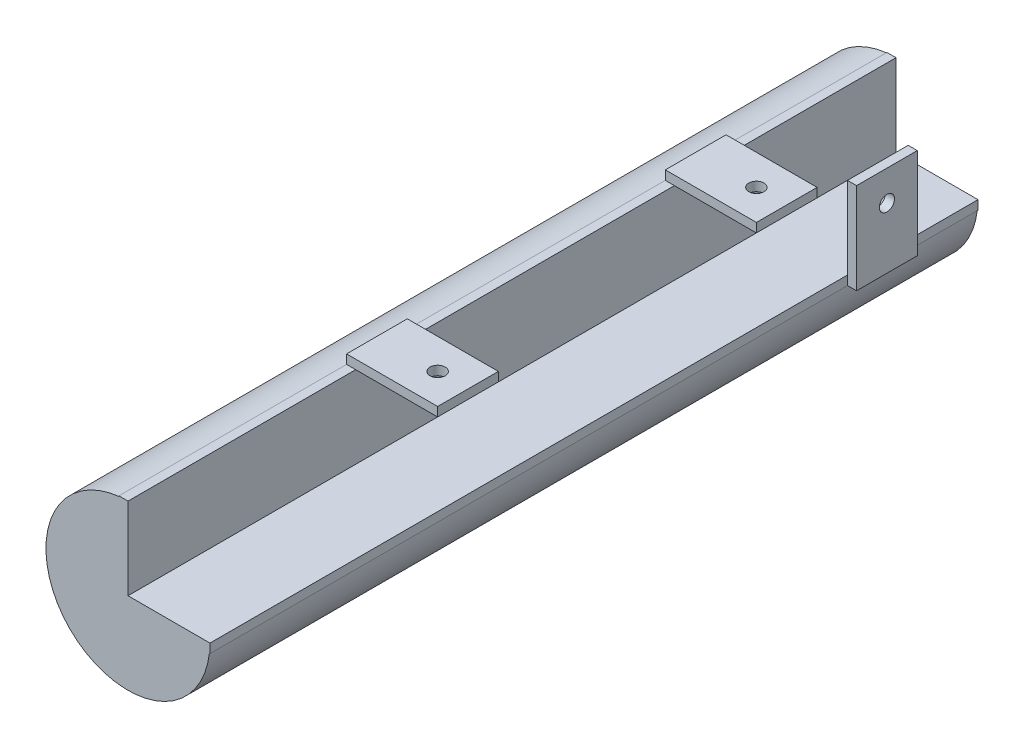
ISO-10303-21;
HEADER;
FILE_DESCRIPTION(('STEP AP214'),'2;1');
FILE_NAME('part.step','',(''),(''),'','','');
FILE_SCHEMA(('AUTOMOTIVE_DESIGN { 1 0 10303 214 1 1 1 1 }'));
ENDSEC;
DATA;
#1=APPLICATION_CONTEXT('core data for automotive mechanical design processes');
#2=APPLICATION_PROTOCOL_DEFINITION('international standard','automotive_design',2000,#1);
#3=PRODUCT_CONTEXT('',#1,'mechanical');
#4=PRODUCT('Part','Part','',(#3));
#5=PRODUCT_RELATED_PRODUCT_CATEGORY('part','',(#4));
#6=PRODUCT_DEFINITION_FORMATION('','',#4);
#7=PRODUCT_DEFINITION_CONTEXT('part definition',#1,'design');
#8=PRODUCT_DEFINITION('design','',#6,#7);
#9=PRODUCT_DEFINITION_SHAPE('','',#8);
#10=(LENGTH_UNIT() NAMED_UNIT(*) SI_UNIT(.MILLI.,.METRE.));
#11=(NAMED_UNIT(*) PLANE_ANGLE_UNIT() SI_UNIT($,.RADIAN.));
#12=(NAMED_UNIT(*) SI_UNIT($,.STERADIAN.) SOLID_ANGLE_UNIT());
#13=UNCERTAINTY_MEASURE_WITH_UNIT(LENGTH_MEASURE(1.E-05),#10,'distance_accuracy_value','');
#14=(GEOMETRIC_REPRESENTATION_CONTEXT(3) GLOBAL_UNCERTAINTY_ASSIGNED_CONTEXT((#13)) GLOBAL_UNIT_ASSIGNED_CONTEXT((#10,
#11,#12)) REPRESENTATION_CONTEXT('',''));
#15=CARTESIAN_POINT('',(0.,0.,0.));
#16=DIRECTION('',(0.,0.,1.));
#17=DIRECTION('',(1.,0.,0.));
#18=AXIS2_PLACEMENT_3D('',#15,#16,#17);
#19=CARTESIAN_POINT('',(0.,27.,126.5));
#20=DIRECTION('',(0.,-1.,0.));
#21=DIRECTION('',(0.,0.,-1.));
#22=AXIS2_PLACEMENT_3D('',#19,#20,#21);
#23=PLANE('',#22);
#24=DIRECTION('',(1.,0.,0.));
#25=VECTOR('',#24,1.);
#26=CARTESIAN_POINT('',(-3.,27.,51.5));
#27=LINE('',#26,#25);
#28=CARTESIAN_POINT('',(-3.,27.,51.5));
#29=VERTEX_POINT('',#28);
#30=CARTESIAN_POINT('',(0.,27.,51.5));
#31=VERTEX_POINT('',#30);
#32=EDGE_CURVE('E229',#29,#31,#27,.T.);
#33=ORIENTED_EDGE('',*,*,#32,.F.);
#34=DIRECTION('',(0.,0.,-1.));
#35=VECTOR('',#34,1.);
#36=CARTESIAN_POINT('',(-3.,27.,126.5));
#37=LINE('',#36,#35);
#38=CARTESIAN_POINT('',(-3.,27.,126.5));
#39=VERTEX_POINT('',#38);
#40=EDGE_CURVE('E403',#39,#29,#37,.T.);
#41=ORIENTED_EDGE('',*,*,#40,.F.);
#42=DIRECTION('',(-1.,0.,0.));
#43=VECTOR('',#42,1.);
#44=CARTESIAN_POINT('',(0.,27.,126.5));
#45=LINE('',#44,#43);
#46=CARTESIAN_POINT('',(0.,27.,126.5));
#47=VERTEX_POINT('',#46);
#48=EDGE_CURVE('E339',#47,#39,#45,.T.);
#49=ORIENTED_EDGE('',*,*,#48,.F.);
#50=DIRECTION('',(0.,0.,-1.));
#51=VECTOR('',#50,1.);
#52=CARTESIAN_POINT('',(0.,27.,126.5));
#53=LINE('',#52,#51);
#54=EDGE_CURVE('E49',#47,#31,#53,.T.);
#55=ORIENTED_EDGE('',*,*,#54,.T.);
#56=EDGE_LOOP('',(#33,#41,#49,#55));
#57=FACE_BOUND('',#56,.T.);
#58=ADVANCED_FACE('F45',(#57),#23,.F.);
#59=DIRECTION('',(-1.,0.,0.));
#60=VECTOR('',#59,1.);
#61=CARTESIAN_POINT('',(-3.,27.,31.5));
#62=LINE('',#61,#60);
#63=CARTESIAN_POINT('',(0.,27.,31.5));
#64=VERTEX_POINT('',#63);
#65=CARTESIAN_POINT('',(-3.,27.,31.5));
#66=VERTEX_POINT('',#65);
#67=EDGE_CURVE('E223',#64,#66,#62,.T.);
#68=ORIENTED_EDGE('',*,*,#67,.F.);
#69=CARTESIAN_POINT('',(0.,27.,-53.5));
#70=VERTEX_POINT('',#69);
#71=EDGE_CURVE('E414',#64,#70,#53,.T.);
#72=ORIENTED_EDGE('',*,*,#71,.T.);
#73=DIRECTION('',(1.,0.,0.));
#74=VECTOR('',#73,1.);
#75=CARTESIAN_POINT('',(-3.,27.,-53.5));
#76=LINE('',#75,#74);
#77=CARTESIAN_POINT('',(-3.,27.,-53.5));
#78=VERTEX_POINT('',#77);
#79=EDGE_CURVE('E261',#78,#70,#76,.T.);
#80=ORIENTED_EDGE('',*,*,#79,.F.);
#81=EDGE_CURVE('E407',#66,#78,#37,.T.);
#82=ORIENTED_EDGE('',*,*,#81,.F.);
#83=EDGE_LOOP('',(#68,#72,#80,#82));
#84=FACE_BOUND('',#83,.T.);
#85=ADVANCED_FACE('F525',(#84),#23,.F.);
#86=DIRECTION('',(-1.,0.,0.));
#87=VECTOR('',#86,1.);
#88=CARTESIAN_POINT('',(-3.,27.,-73.5));
#89=LINE('',#88,#87);
#90=CARTESIAN_POINT('',(0.,27.,-73.5));
#91=VERTEX_POINT('',#90);
#92=CARTESIAN_POINT('',(-3.,27.,-73.5));
#93=VERTEX_POINT('',#92);
#94=EDGE_CURVE('E11',#91,#93,#89,.T.);
#95=ORIENTED_EDGE('',*,*,#94,.F.);
#96=CARTESIAN_POINT('',(0.,27.,-126.5));
#97=VERTEX_POINT('',#96);
#98=EDGE_CURVE('E406',#91,#97,#53,.T.);
#99=ORIENTED_EDGE('',*,*,#98,.T.);
#100=DIRECTION('',(-1.,0.,0.));
#101=VECTOR('',#100,1.);
#102=CARTESIAN_POINT('',(0.,27.,-126.5));
#103=LINE('',#102,#101);
#104=CARTESIAN_POINT('',(-3.,27.,-126.5));
#105=VERTEX_POINT('',#104);
#106=EDGE_CURVE('E362',#97,#105,#103,.T.);
#107=ORIENTED_EDGE('',*,*,#106,.T.);
#108=EDGE_CURVE('E402',#93,#105,#37,.T.);
#109=ORIENTED_EDGE('',*,*,#108,.F.);
#110=EDGE_LOOP('',(#95,#99,#107,#109));
#111=FACE_BOUND('',#110,.T.);
#112=ADVANCED_FACE('F422',(#111),#23,.F.);
#113=CARTESIAN_POINT('',(27.,0.,126.5));
#114=DIRECTION('',(-1.,0.,0.));
#115=DIRECTION('',(0.,0.,1.));
#116=AXIS2_PLACEMENT_3D('',#113,#114,#115);
#117=PLANE('',#116);
#118=DIRECTION('',(0.,-1.,0.));
#119=VECTOR('',#118,1.);
#120=CARTESIAN_POINT('',(27.,-3.,-83.5));
#121=LINE('',#120,#119);
#122=CARTESIAN_POINT('',(27.,0.,-83.5));
#123=VERTEX_POINT('',#122);
#124=CARTESIAN_POINT('',(27.,-3.,-83.5));
#125=VERTEX_POINT('',#124);
#126=EDGE_CURVE('E55',#123,#125,#121,.T.);
#127=ORIENTED_EDGE('',*,*,#126,.F.);
#128=DIRECTION('',(0.,0.,-1.));
#129=VECTOR('',#128,1.);
#130=CARTESIAN_POINT('',(27.,0.,126.5));
#131=LINE('',#130,#129);
#132=CARTESIAN_POINT('',(27.,0.,126.5));
#133=VERTEX_POINT('',#132);
#134=EDGE_CURVE('E386',#133,#123,#131,.T.);
#135=ORIENTED_EDGE('',*,*,#134,.F.);
#136=DIRECTION('',(0.,1.,0.));
#137=VECTOR('',#136,1.);
#138=CARTESIAN_POINT('',(27.,0.,126.5));
#139=LINE('',#138,#137);
#140=CARTESIAN_POINT('',(27.,-3.,126.5));
#141=VERTEX_POINT('',#140);
#142=EDGE_CURVE('E352',#141,#133,#139,.T.);
#143=ORIENTED_EDGE('',*,*,#142,.F.);
#144=DIRECTION('',(0.,0.,-1.));
#145=VECTOR('',#144,1.);
#146=CARTESIAN_POINT('',(27.,-3.,126.5));
#147=LINE('',#146,#145);
#148=EDGE_CURVE('E392',#141,#125,#147,.T.);
#149=ORIENTED_EDGE('',*,*,#148,.T.);
#150=EDGE_LOOP('',(#127,#135,#143,#149));
#151=FACE_BOUND('',#150,.T.);
#152=ADVANCED_FACE('F501',(#151),#117,.F.);
#153=DIRECTION('',(0.,1.,0.));
#154=VECTOR('',#153,1.);
#155=CARTESIAN_POINT('',(27.,-3.,-103.5));
#156=LINE('',#155,#154);
#157=CARTESIAN_POINT('',(27.,-3.,-103.5));
#158=VERTEX_POINT('',#157);
#159=CARTESIAN_POINT('',(27.,0.,-103.5));
#160=VERTEX_POINT('',#159);
#161=EDGE_CURVE('E313',#158,#160,#156,.T.);
#162=ORIENTED_EDGE('',*,*,#161,.F.);
#163=CARTESIAN_POINT('',(27.,-3.,-126.5));
#164=VERTEX_POINT('',#163);
#165=EDGE_CURVE('E390',#158,#164,#147,.T.);
#166=ORIENTED_EDGE('',*,*,#165,.T.);
#167=DIRECTION('',(0.,1.,0.));
#168=VECTOR('',#167,1.);
#169=CARTESIAN_POINT('',(27.,0.,-126.5));
#170=LINE('',#169,#168);
#171=CARTESIAN_POINT('',(27.,0.,-126.5));
#172=VERTEX_POINT('',#171);
#173=EDGE_CURVE('E376',#164,#172,#170,.T.);
#174=ORIENTED_EDGE('',*,*,#173,.T.);
#175=EDGE_CURVE('E385',#160,#172,#131,.T.);
#176=ORIENTED_EDGE('',*,*,#175,.F.);
#177=EDGE_LOOP('',(#162,#166,#174,#176));
#178=FACE_BOUND('',#177,.T.);
#179=ADVANCED_FACE('F481',(#178),#117,.F.);
#180=CARTESIAN_POINT('',(0.,27.,126.5));
#181=DIRECTION('',(-1.,0.,0.));
#182=DIRECTION('',(0.,-1.,0.));
#183=AXIS2_PLACEMENT_3D('',#180,#181,#182);
#184=PLANE('',#183);
#185=DIRECTION('',(0.,1.,0.));
#186=VECTOR('',#185,1.);
#187=CARTESIAN_POINT('',(0.,27.,-126.5));
#188=LINE('',#187,#186);
#189=CARTESIAN_POINT('',(0.,0.,-126.5));
#190=VERTEX_POINT('',#189);
#191=EDGE_CURVE('E334',#190,#97,#188,.T.);
#192=ORIENTED_EDGE('',*,*,#191,.T.);
#193=ORIENTED_EDGE('',*,*,#98,.F.);
#194=EDGE_CURVE('E413',#70,#91,#53,.T.);
#195=ORIENTED_EDGE('',*,*,#194,.F.);
#196=ORIENTED_EDGE('',*,*,#71,.F.);
#197=DIRECTION('',(0.,0.,1.));
#198=VECTOR('',#197,1.);
#199=CARTESIAN_POINT('',(0.,27.,126.5));
#200=LINE('',#199,#198);
#201=EDGE_CURVE('E221',#64,#31,#200,.T.);
#202=ORIENTED_EDGE('',*,*,#201,.T.);
#203=ORIENTED_EDGE('',*,*,#54,.F.);
#204=DIRECTION('',(0.,1.,0.));
#205=VECTOR('',#204,1.);
#206=CARTESIAN_POINT('',(0.,27.,126.5));
#207=LINE('',#206,#205);
#208=CARTESIAN_POINT('',(0.,0.,126.5));
#209=VERTEX_POINT('',#208);
#210=EDGE_CURVE('E335',#209,#47,#207,.T.);
#211=ORIENTED_EDGE('',*,*,#210,.F.);
#212=DIRECTION('',(0.,0.,-1.));
#213=VECTOR('',#212,1.);
#214=CARTESIAN_POINT('',(0.,0.,126.5));
#215=LINE('',#214,#213);
#216=EDGE_CURVE('E358',#209,#190,#215,.T.);
#217=ORIENTED_EDGE('',*,*,#216,.T.);
#218=EDGE_LOOP('',(#192,#193,#195,#196,#202,#203,#211,#217));
#219=FACE_BOUND('',#218,.T.);
#220=ADVANCED_FACE('F47',(#219),#184,.F.);
#221=CARTESIAN_POINT('',(-3.,27.,126.5));
#222=DIRECTION('',(1.,0.,0.));
#223=DIRECTION('',(0.,0.,-1.));
#224=AXIS2_PLACEMENT_3D('',#221,#222,#223);
#225=PLANE('',#224);
#226=DIRECTION('',(0.,-1.,0.));
#227=VECTOR('',#226,1.);
#228=CARTESIAN_POINT('',(-3.,27.,-126.5));
#229=LINE('',#228,#227);
#230=CARTESIAN_POINT('',(-3.,26.8328157299975,-126.5));
#231=VERTEX_POINT('',#230);
#232=EDGE_CURVE('E366',#105,#231,#229,.T.);
#233=ORIENTED_EDGE('',*,*,#232,.T.);
#234=DIRECTION('',(0.,0.,-1.));
#235=VECTOR('',#234,1.);
#236=CARTESIAN_POINT('',(-3.,26.8328157299975,126.5));
#237=LINE('',#236,#235);
#238=CARTESIAN_POINT('',(-3.,26.8328157299975,126.5));
#239=VERTEX_POINT('',#238);
#240=EDGE_CURVE('E399',#239,#231,#237,.T.);
#241=ORIENTED_EDGE('',*,*,#240,.F.);
#242=DIRECTION('',(0.,-1.,0.));
#243=VECTOR('',#242,1.);
#244=CARTESIAN_POINT('',(-3.,27.,126.5));
#245=LINE('',#244,#243);
#246=EDGE_CURVE('E343',#39,#239,#245,.T.);
#247=ORIENTED_EDGE('',*,*,#246,.F.);
#248=ORIENTED_EDGE('',*,*,#40,.T.);
#249=DIRECTION('',(0.,-1.,0.));
#250=VECTOR('',#249,1.);
#251=CARTESIAN_POINT('',(-3.,30.,51.5));
#252=LINE('',#251,#250);
#253=CARTESIAN_POINT('',(-3.,30.,51.5));
#254=VERTEX_POINT('',#253);
#255=EDGE_CURVE('E449',#254,#29,#252,.T.);
#256=ORIENTED_EDGE('',*,*,#255,.F.);
#257=DIRECTION('',(0.,0.,1.));
#258=VECTOR('',#257,1.);
#259=CARTESIAN_POINT('',(-3.,30.,51.5));
#260=LINE('',#259,#258);
#261=CARTESIAN_POINT('',(-3.,30.,31.5));
#262=VERTEX_POINT('',#261);
#263=EDGE_CURVE('E226',#262,#254,#260,.T.);
#264=ORIENTED_EDGE('',*,*,#263,.F.);
#265=DIRECTION('',(0.,-1.,0.));
#266=VECTOR('',#265,1.);
#267=CARTESIAN_POINT('',(-3.,30.,31.5));
#268=LINE('',#267,#266);
#269=EDGE_CURVE('E64',#262,#66,#268,.T.);
#270=ORIENTED_EDGE('',*,*,#269,.T.);
#271=ORIENTED_EDGE('',*,*,#81,.T.);
#272=DIRECTION('',(0.,-1.,0.));
#273=VECTOR('',#272,1.);
#274=CARTESIAN_POINT('',(-3.,30.,-53.5));
#275=LINE('',#274,#273);
#276=CARTESIAN_POINT('',(-3.,30.,-53.5));
#277=VERTEX_POINT('',#276);
#278=EDGE_CURVE('E281',#277,#78,#275,.T.);
#279=ORIENTED_EDGE('',*,*,#278,.F.);
#280=DIRECTION('',(0.,0.,1.));
#281=VECTOR('',#280,1.);
#282=CARTESIAN_POINT('',(-3.,30.,-73.5));
#283=LINE('',#282,#281);
#284=CARTESIAN_POINT('',(-3.,30.,-73.5));
#285=VERTEX_POINT('',#284);
#286=EDGE_CURVE('E247',#285,#277,#283,.T.);
#287=ORIENTED_EDGE('',*,*,#286,.F.);
#288=DIRECTION('',(0.,-1.,0.));
#289=VECTOR('',#288,1.);
#290=CARTESIAN_POINT('',(-3.,30.,-73.5));
#291=LINE('',#290,#289);
#292=EDGE_CURVE('E260',#285,#93,#291,.T.);
#293=ORIENTED_EDGE('',*,*,#292,.T.);
#294=ORIENTED_EDGE('',*,*,#108,.T.);
#295=EDGE_LOOP('',(#233,#241,#247,#248,#256,#264,#270,#271,#279,#287,#293,#294));
#296=FACE_BOUND('',#295,.T.);
#297=ADVANCED_FACE('F416',(#296),#225,.F.);
#298=CARTESIAN_POINT('',(-0.0331449920469178,-0.00368499870751979,126.5));
#299=DIRECTION('',(0.,0.,-1.));
#300=DIRECTION('',(-1.,0.,0.));
#301=AXIS2_PLACEMENT_3D('',#298,#299,#300);
#302=CYLINDRICAL_SURFACE('',#301,27.);
#303=CARTESIAN_POINT('',(-0.0331449920469178,-0.00368499870751979,-126.5));
#304=DIRECTION('',(0.,0.,1.));
#305=DIRECTION('',(1.,0.,0.));
#306=AXIS2_PLACEMENT_3D('',#303,#304,#305);
#307=CIRCLE('',#306,27.);
#308=CARTESIAN_POINT('',(26.8000824771382,-3.,-126.5));
#309=VERTEX_POINT('',#308);
#310=EDGE_CURVE('E369',#231,#309,#307,.T.);
#311=ORIENTED_EDGE('',*,*,#310,.T.);
#312=DIRECTION('',(0.,0.,-1.));
#313=VECTOR('',#312,1.);
#314=CARTESIAN_POINT('',(26.8000824771382,-3.,126.5));
#315=LINE('',#314,#313);
#316=CARTESIAN_POINT('',(26.8000824771382,-3.,126.5));
#317=VERTEX_POINT('',#316);
#318=EDGE_CURVE('E395',#317,#309,#315,.T.);
#319=ORIENTED_EDGE('',*,*,#318,.F.);
#320=CARTESIAN_POINT('',(-0.0331449920469178,-0.00368499870751979,126.5));
#321=DIRECTION('',(0.,0.,1.));
#322=DIRECTION('',(1.,0.,0.));
#323=AXIS2_PLACEMENT_3D('',#320,#321,#322);
#324=CIRCLE('',#323,27.);
#325=EDGE_CURVE('E346',#239,#317,#324,.T.);
#326=ORIENTED_EDGE('',*,*,#325,.F.);
#327=ORIENTED_EDGE('',*,*,#240,.T.);
#328=EDGE_LOOP('',(#311,#319,#326,#327));
#329=FACE_BOUND('',#328,.T.);
#330=ADVANCED_FACE('F431',(#329),#302,.T.);
#331=CARTESIAN_POINT('',(27.,-3.,126.5));
#332=DIRECTION('',(0.,1.,0.));
#333=DIRECTION('',(0.,0.,1.));
#334=AXIS2_PLACEMENT_3D('',#331,#332,#333);
#335=PLANE('',#334);
#336=DIRECTION('',(1.,0.,0.));
#337=VECTOR('',#336,1.);
#338=CARTESIAN_POINT('',(27.,-3.,-126.5));
#339=LINE('',#338,#337);
#340=EDGE_CURVE('E372',#309,#164,#339,.T.);
#341=ORIENTED_EDGE('',*,*,#340,.T.);
#342=ORIENTED_EDGE('',*,*,#165,.F.);
#343=DIRECTION('',(-1.,0.,0.));
#344=VECTOR('',#343,1.);
#345=CARTESIAN_POINT('',(30.,-3.,-103.5));
#346=LINE('',#345,#344);
#347=CARTESIAN_POINT('',(30.,-3.,-103.5));
#348=VERTEX_POINT('',#347);
#349=EDGE_CURVE('E326',#348,#158,#346,.T.);
#350=ORIENTED_EDGE('',*,*,#349,.F.);
#351=DIRECTION('',(0.,0.,-1.));
#352=VECTOR('',#351,1.);
#353=CARTESIAN_POINT('',(30.,-3.,-83.5));
#354=LINE('',#353,#352);
#355=CARTESIAN_POINT('',(30.,-3.,-83.5));
#356=VERTEX_POINT('',#355);
#357=EDGE_CURVE('E298',#356,#348,#354,.T.);
#358=ORIENTED_EDGE('',*,*,#357,.F.);
#359=DIRECTION('',(-1.,0.,0.));
#360=VECTOR('',#359,1.);
#361=CARTESIAN_POINT('',(30.,-3.,-83.5));
#362=LINE('',#361,#360);
#363=EDGE_CURVE('E330',#356,#125,#362,.T.);
#364=ORIENTED_EDGE('',*,*,#363,.T.);
#365=ORIENTED_EDGE('',*,*,#148,.F.);
#366=DIRECTION('',(1.,0.,0.));
#367=VECTOR('',#366,1.);
#368=CARTESIAN_POINT('',(27.,-3.,126.5));
#369=LINE('',#368,#367);
#370=EDGE_CURVE('E349',#317,#141,#369,.T.);
#371=ORIENTED_EDGE('',*,*,#370,.F.);
#372=ORIENTED_EDGE('',*,*,#318,.T.);
#373=EDGE_LOOP('',(#341,#342,#350,#358,#364,#365,#371,#372));
#374=FACE_BOUND('',#373,.T.);
#375=ADVANCED_FACE('F435',(#374),#335,.F.);
#376=CARTESIAN_POINT('',(0.,0.,126.5));
#377=DIRECTION('',(0.,-1.,0.));
#378=DIRECTION('',(0.,0.,-1.));
#379=AXIS2_PLACEMENT_3D('',#376,#377,#378);
#380=PLANE('',#379);
#381=DIRECTION('',(-1.,0.,0.));
#382=VECTOR('',#381,1.);
#383=CARTESIAN_POINT('',(0.,0.,-126.5));
#384=LINE('',#383,#382);
#385=EDGE_CURVE('E340',#172,#190,#384,.T.);
#386=ORIENTED_EDGE('',*,*,#385,.T.);
#387=ORIENTED_EDGE('',*,*,#216,.F.);
#388=DIRECTION('',(-1.,0.,0.));
#389=VECTOR('',#388,1.);
#390=CARTESIAN_POINT('',(0.,0.,126.5));
#391=LINE('',#390,#389);
#392=EDGE_CURVE('E355',#133,#209,#391,.T.);
#393=ORIENTED_EDGE('',*,*,#392,.F.);
#394=ORIENTED_EDGE('',*,*,#134,.T.);
#395=EDGE_CURVE('E391',#123,#160,#131,.T.);
#396=ORIENTED_EDGE('',*,*,#395,.T.);
#397=ORIENTED_EDGE('',*,*,#175,.T.);
#398=EDGE_LOOP('',(#386,#387,#393,#394,#396,#397));
#399=FACE_BOUND('',#398,.T.);
#400=ADVANCED_FACE('F505',(#399),#380,.F.);
#401=CARTESIAN_POINT('',(-0.0331449920469178,-0.00368499870751979,126.5));
#402=DIRECTION('',(0.,0.,1.));
#403=DIRECTION('',(1.,0.,0.));
#404=AXIS2_PLACEMENT_3D('',#401,#402,#403);
#405=PLANE('',#404);
#406=ORIENTED_EDGE('',*,*,#210,.T.);
#407=ORIENTED_EDGE('',*,*,#48,.T.);
#408=ORIENTED_EDGE('',*,*,#246,.T.);
#409=ORIENTED_EDGE('',*,*,#325,.T.);
#410=ORIENTED_EDGE('',*,*,#370,.T.);
#411=ORIENTED_EDGE('',*,*,#142,.T.);
#412=ORIENTED_EDGE('',*,*,#392,.T.);
#413=EDGE_LOOP('',(#406,#407,#408,#409,#410,#411,#412));
#414=FACE_BOUND('',#413,.T.);
#415=ADVANCED_FACE('F440',(#414),#405,.T.);
#416=CARTESIAN_POINT('',(-0.0331449920469178,-0.00368499870751979,-126.5));
#417=DIRECTION('',(0.,0.,1.));
#418=DIRECTION('',(1.,0.,0.));
#419=AXIS2_PLACEMENT_3D('',#416,#417,#418);
#420=PLANE('',#419);
#421=ORIENTED_EDGE('',*,*,#191,.F.);
#422=ORIENTED_EDGE('',*,*,#385,.F.);
#423=ORIENTED_EDGE('',*,*,#173,.F.);
#424=ORIENTED_EDGE('',*,*,#340,.F.);
#425=ORIENTED_EDGE('',*,*,#310,.F.);
#426=ORIENTED_EDGE('',*,*,#232,.F.);
#427=ORIENTED_EDGE('',*,*,#106,.F.);
#428=EDGE_LOOP('',(#421,#422,#423,#424,#425,#426,#427));
#429=FACE_BOUND('',#428,.T.);
#430=ADVANCED_FACE('F426',(#429),#420,.F.);
#431=CARTESIAN_POINT('',(27.,0.,0.));
#432=DIRECTION('',(-1.,0.,0.));
#433=DIRECTION('',(0.,0.,1.));
#434=AXIS2_PLACEMENT_3D('',#431,#432,#433);
#435=PLANE('',#434);
#436=CARTESIAN_POINT('',(27.,17.,-93.5));
#437=DIRECTION('',(-1.,0.,0.));
#438=DIRECTION('',(0.,0.,1.));
#439=AXIS2_PLACEMENT_3D('',#436,#437,#438);
#440=CIRCLE('',#439,2.50000000000001);
#441=CARTESIAN_POINT('',(27.,17.,-91.));
#442=VERTEX_POINT('',#441);
#443=EDGE_CURVE('E286',#442,#442,#440,.F.);
#444=ORIENTED_EDGE('',*,*,#443,.T.);
#445=EDGE_LOOP('',(#444));
#446=FACE_BOUND('',#445,.T.);
#447=ORIENTED_EDGE('',*,*,#395,.F.);
#448=CARTESIAN_POINT('',(27.,27.,-83.5));
#449=VERTEX_POINT('',#448);
#450=EDGE_CURVE('E290',#449,#123,#121,.T.);
#451=ORIENTED_EDGE('',*,*,#450,.F.);
#452=DIRECTION('',(0.,0.,1.));
#453=VECTOR('',#452,1.);
#454=CARTESIAN_POINT('',(27.,27.,-83.5));
#455=LINE('',#454,#453);
#456=CARTESIAN_POINT('',(27.,27.,-103.5));
#457=VERTEX_POINT('',#456);
#458=EDGE_CURVE('E299',#457,#449,#455,.T.);
#459=ORIENTED_EDGE('',*,*,#458,.F.);
#460=EDGE_CURVE('E312',#160,#457,#156,.T.);
#461=ORIENTED_EDGE('',*,*,#460,.F.);
#462=EDGE_LOOP('',(#447,#451,#459,#461));
#463=FACE_BOUND('',#462,.T.);
#464=ADVANCED_FACE('F509',(#446,#463),#435,.T.);
#465=CARTESIAN_POINT('',(30.,-3.,-83.5));
#466=DIRECTION('',(0.,0.,-1.));
#467=DIRECTION('',(-1.,0.,0.));
#468=AXIS2_PLACEMENT_3D('',#465,#466,#467);
#469=PLANE('',#468);
#470=ORIENTED_EDGE('',*,*,#450,.T.);
#471=ORIENTED_EDGE('',*,*,#126,.T.);
#472=ORIENTED_EDGE('',*,*,#363,.F.);
#473=DIRECTION('',(0.,-1.,0.));
#474=VECTOR('',#473,1.);
#475=CARTESIAN_POINT('',(30.,-3.,-83.5));
#476=LINE('',#475,#474);
#477=CARTESIAN_POINT('',(30.,27.,-83.5));
#478=VERTEX_POINT('',#477);
#479=EDGE_CURVE('E294',#478,#356,#476,.T.);
#480=ORIENTED_EDGE('',*,*,#479,.F.);
#481=DIRECTION('',(-1.,0.,0.));
#482=VECTOR('',#481,1.);
#483=CARTESIAN_POINT('',(30.,27.,-83.5));
#484=LINE('',#483,#482);
#485=EDGE_CURVE('E308',#478,#449,#484,.T.);
#486=ORIENTED_EDGE('',*,*,#485,.T.);
#487=EDGE_LOOP('',(#470,#471,#472,#480,#486));
#488=FACE_BOUND('',#487,.T.);
#489=ADVANCED_FACE('F497',(#488),#469,.F.);
#490=CARTESIAN_POINT('',(30.,-3.,-103.5));
#491=DIRECTION('',(0.,0.,1.));
#492=DIRECTION('',(1.,0.,0.));
#493=AXIS2_PLACEMENT_3D('',#490,#491,#492);
#494=PLANE('',#493);
#495=ORIENTED_EDGE('',*,*,#161,.T.);
#496=ORIENTED_EDGE('',*,*,#460,.T.);
#497=DIRECTION('',(-1.,0.,0.));
#498=VECTOR('',#497,1.);
#499=CARTESIAN_POINT('',(30.,27.,-103.5));
#500=LINE('',#499,#498);
#501=CARTESIAN_POINT('',(30.,27.,-103.5));
#502=VERTEX_POINT('',#501);
#503=EDGE_CURVE('E322',#502,#457,#500,.T.);
#504=ORIENTED_EDGE('',*,*,#503,.F.);
#505=DIRECTION('',(0.,1.,0.));
#506=VECTOR('',#505,1.);
#507=CARTESIAN_POINT('',(30.,-3.,-103.5));
#508=LINE('',#507,#506);
#509=EDGE_CURVE('E302',#348,#502,#508,.T.);
#510=ORIENTED_EDGE('',*,*,#509,.F.);
#511=ORIENTED_EDGE('',*,*,#349,.T.);
#512=EDGE_LOOP('',(#495,#496,#504,#510,#511));
#513=FACE_BOUND('',#512,.T.);
#514=ADVANCED_FACE('F487',(#513),#494,.F.);
#515=CARTESIAN_POINT('',(30.,27.,-83.5));
#516=DIRECTION('',(0.,-1.,0.));
#517=DIRECTION('',(0.,0.,-1.));
#518=AXIS2_PLACEMENT_3D('',#515,#516,#517);
#519=PLANE('',#518);
#520=ORIENTED_EDGE('',*,*,#458,.T.);
#521=ORIENTED_EDGE('',*,*,#485,.F.);
#522=DIRECTION('',(0.,0.,1.));
#523=VECTOR('',#522,1.);
#524=CARTESIAN_POINT('',(30.,27.,-83.5));
#525=LINE('',#524,#523);
#526=EDGE_CURVE('E305',#502,#478,#525,.T.);
#527=ORIENTED_EDGE('',*,*,#526,.F.);
#528=ORIENTED_EDGE('',*,*,#503,.T.);
#529=EDGE_LOOP('',(#520,#521,#527,#528));
#530=FACE_BOUND('',#529,.T.);
#531=ADVANCED_FACE('F512',(#530),#519,.F.);
#532=CARTESIAN_POINT('',(30.,0.,0.));
#533=DIRECTION('',(-1.,0.,0.));
#534=DIRECTION('',(0.,0.,1.));
#535=AXIS2_PLACEMENT_3D('',#532,#533,#534);
#536=PLANE('',#535);
#537=CARTESIAN_POINT('',(30.,17.,-93.5));
#538=DIRECTION('',(1.,0.,0.));
#539=DIRECTION('',(0.,0.,-1.));
#540=AXIS2_PLACEMENT_3D('',#537,#538,#539);
#541=CIRCLE('',#540,2.50000000000001);
#542=CARTESIAN_POINT('',(30.,17.,-96.));
#543=VERTEX_POINT('',#542);
#544=EDGE_CURVE('E285',#543,#543,#541,.T.);
#545=ORIENTED_EDGE('',*,*,#544,.F.);
#546=EDGE_LOOP('',(#545));
#547=FACE_BOUND('',#546,.T.);
#548=ORIENTED_EDGE('',*,*,#479,.T.);
#549=ORIENTED_EDGE('',*,*,#357,.T.);
#550=ORIENTED_EDGE('',*,*,#509,.T.);
#551=ORIENTED_EDGE('',*,*,#526,.T.);
#552=EDGE_LOOP('',(#548,#549,#550,#551));
#553=FACE_BOUND('',#552,.T.);
#554=ADVANCED_FACE('F491',(#547,#553),#536,.F.);
#555=CARTESIAN_POINT('',(-27.0341449920469,17.,-93.5));
#556=DIRECTION('',(1.,0.,0.));
#557=DIRECTION('',(0.,0.,-1.));
#558=AXIS2_PLACEMENT_3D('',#555,#556,#557);
#559=CYLINDRICAL_SURFACE('',#558,2.50000000000001);
#560=ORIENTED_EDGE('',*,*,#443,.F.);
#561=EDGE_LOOP('',(#560));
#562=FACE_BOUND('',#561,.T.);
#563=ORIENTED_EDGE('',*,*,#544,.T.);
#564=EDGE_LOOP('',(#563));
#565=FACE_BOUND('',#564,.T.);
#566=ADVANCED_FACE('F519',(#562,#565),#559,.F.);
#567=CARTESIAN_POINT('',(0.,27.,0.));
#568=DIRECTION('',(0.,1.,0.));
#569=DIRECTION('',(0.,0.,1.));
#570=AXIS2_PLACEMENT_3D('',#567,#568,#569);
#571=PLANE('',#570);
#572=CARTESIAN_POINT('',(17.,27.,-63.5));
#573=DIRECTION('',(0.,1.,0.));
#574=DIRECTION('',(0.,0.,1.));
#575=AXIS2_PLACEMENT_3D('',#572,#573,#574);
#576=CIRCLE('',#575,2.5);
#577=CARTESIAN_POINT('',(17.,27.,-61.));
#578=VERTEX_POINT('',#577);
#579=EDGE_CURVE('E898',#578,#578,#576,.F.);
#580=ORIENTED_EDGE('',*,*,#579,.F.);
#581=EDGE_LOOP('',(#580));
#582=FACE_BOUND('',#581,.T.);
#583=CARTESIAN_POINT('',(27.,27.,-53.5));
#584=VERTEX_POINT('',#583);
#585=EDGE_CURVE('E246',#70,#584,#76,.T.);
#586=ORIENTED_EDGE('',*,*,#585,.F.);
#587=ORIENTED_EDGE('',*,*,#194,.T.);
#588=CARTESIAN_POINT('',(27.,27.,-73.5));
#589=VERTEX_POINT('',#588);
#590=EDGE_CURVE('E57',#589,#91,#89,.T.);
#591=ORIENTED_EDGE('',*,*,#590,.F.);
#592=DIRECTION('',(0.,0.,-1.));
#593=VECTOR('',#592,1.);
#594=CARTESIAN_POINT('',(27.,27.,-73.5));
#595=LINE('',#594,#593);
#596=EDGE_CURVE('E265',#584,#589,#595,.T.);
#597=ORIENTED_EDGE('',*,*,#596,.F.);
#598=EDGE_LOOP('',(#586,#587,#591,#597));
#599=FACE_BOUND('',#598,.T.);
#600=ADVANCED_FACE('F462',(#582,#599),#571,.F.);
#601=CARTESIAN_POINT('',(-3.,30.,-53.5));
#602=DIRECTION('',(0.,0.,-1.));
#603=DIRECTION('',(-1.,0.,0.));
#604=AXIS2_PLACEMENT_3D('',#601,#602,#603);
#605=PLANE('',#604);
#606=ORIENTED_EDGE('',*,*,#79,.T.);
#607=ORIENTED_EDGE('',*,*,#585,.T.);
#608=DIRECTION('',(0.,-1.,0.));
#609=VECTOR('',#608,1.);
#610=CARTESIAN_POINT('',(27.,30.,-53.5));
#611=LINE('',#610,#609);
#612=CARTESIAN_POINT('',(27.,30.,-53.5));
#613=VERTEX_POINT('',#612);
#614=EDGE_CURVE('E277',#613,#584,#611,.T.);
#615=ORIENTED_EDGE('',*,*,#614,.F.);
#616=DIRECTION('',(1.,0.,0.));
#617=VECTOR('',#616,1.);
#618=CARTESIAN_POINT('',(-3.,30.,-53.5));
#619=LINE('',#618,#617);
#620=EDGE_CURVE('E251',#277,#613,#619,.T.);
#621=ORIENTED_EDGE('',*,*,#620,.F.);
#622=ORIENTED_EDGE('',*,*,#278,.T.);
#623=EDGE_LOOP('',(#606,#607,#615,#621,#622));
#624=FACE_BOUND('',#623,.T.);
#625=ADVANCED_FACE('F473',(#624),#605,.F.);
#626=CARTESIAN_POINT('',(27.,30.,-73.5));
#627=DIRECTION('',(-1.,0.,0.));
#628=DIRECTION('',(0.,0.,1.));
#629=AXIS2_PLACEMENT_3D('',#626,#627,#628);
#630=PLANE('',#629);
#631=ORIENTED_EDGE('',*,*,#596,.T.);
#632=DIRECTION('',(0.,-1.,0.));
#633=VECTOR('',#632,1.);
#634=CARTESIAN_POINT('',(27.,30.,-73.5));
#635=LINE('',#634,#633);
#636=CARTESIAN_POINT('',(27.,30.,-73.5));
#637=VERTEX_POINT('',#636);
#638=EDGE_CURVE('E273',#637,#589,#635,.T.);
#639=ORIENTED_EDGE('',*,*,#638,.F.);
#640=DIRECTION('',(0.,0.,-1.));
#641=VECTOR('',#640,1.);
#642=CARTESIAN_POINT('',(27.,30.,-73.5));
#643=LINE('',#642,#641);
#644=EDGE_CURVE('E254',#613,#637,#643,.T.);
#645=ORIENTED_EDGE('',*,*,#644,.F.);
#646=ORIENTED_EDGE('',*,*,#614,.T.);
#647=EDGE_LOOP('',(#631,#639,#645,#646));
#648=FACE_BOUND('',#647,.T.);
#649=ADVANCED_FACE('F470',(#648),#630,.F.);
#650=CARTESIAN_POINT('',(-3.,30.,-73.5));
#651=DIRECTION('',(0.,0.,1.));
#652=DIRECTION('',(1.,0.,0.));
#653=AXIS2_PLACEMENT_3D('',#650,#651,#652);
#654=PLANE('',#653);
#655=ORIENTED_EDGE('',*,*,#590,.T.);
#656=ORIENTED_EDGE('',*,*,#94,.T.);
#657=ORIENTED_EDGE('',*,*,#292,.F.);
#658=DIRECTION('',(-1.,0.,0.));
#659=VECTOR('',#658,1.);
#660=CARTESIAN_POINT('',(-3.,30.,-73.5));
#661=LINE('',#660,#659);
#662=EDGE_CURVE('E257',#637,#285,#661,.T.);
#663=ORIENTED_EDGE('',*,*,#662,.F.);
#664=ORIENTED_EDGE('',*,*,#638,.T.);
#665=EDGE_LOOP('',(#655,#656,#657,#663,#664));
#666=FACE_BOUND('',#665,.T.);
#667=ADVANCED_FACE('F465',(#666),#654,.F.);
#668=CARTESIAN_POINT('',(0.,30.,0.));
#669=DIRECTION('',(0.,1.,0.));
#670=DIRECTION('',(0.,0.,1.));
#671=AXIS2_PLACEMENT_3D('',#668,#669,#670);
#672=PLANE('',#671);
#673=CARTESIAN_POINT('',(17.,30.,-63.5));
#674=DIRECTION('',(0.,1.,0.));
#675=DIRECTION('',(0.,0.,1.));
#676=AXIS2_PLACEMENT_3D('',#673,#674,#675);
#677=CIRCLE('',#676,2.5);
#678=CARTESIAN_POINT('',(17.,30.,-61.));
#679=VERTEX_POINT('',#678);
#680=EDGE_CURVE('E895',#679,#679,#677,.T.);
#681=ORIENTED_EDGE('',*,*,#680,.F.);
#682=EDGE_LOOP('',(#681));
#683=FACE_BOUND('',#682,.T.);
#684=ORIENTED_EDGE('',*,*,#286,.T.);
#685=ORIENTED_EDGE('',*,*,#620,.T.);
#686=ORIENTED_EDGE('',*,*,#644,.T.);
#687=ORIENTED_EDGE('',*,*,#662,.T.);
#688=EDGE_LOOP('',(#684,#685,#686,#687));
#689=FACE_BOUND('',#688,.T.);
#690=ADVANCED_FACE('F701',(#683,#689),#672,.T.);
#691=CARTESIAN_POINT('',(0.,27.,0.));
#692=DIRECTION('',(0.,-1.,0.));
#693=DIRECTION('',(0.,0.,-1.));
#694=AXIS2_PLACEMENT_3D('',#691,#692,#693);
#695=PLANE('',#694);
#696=CARTESIAN_POINT('',(17.,27.,41.5));
#697=DIRECTION('',(0.,-1.,0.));
#698=DIRECTION('',(0.,0.,-1.));
#699=AXIS2_PLACEMENT_3D('',#696,#697,#698);
#700=CIRCLE('',#699,2.5);
#701=CARTESIAN_POINT('',(17.,27.,39.));
#702=VERTEX_POINT('',#701);
#703=EDGE_CURVE('E906',#702,#702,#700,.F.);
#704=ORIENTED_EDGE('',*,*,#703,.T.);
#705=EDGE_LOOP('',(#704));
#706=FACE_BOUND('',#705,.T.);
#707=ORIENTED_EDGE('',*,*,#201,.F.);
#708=CARTESIAN_POINT('',(27.,27.,31.5));
#709=VERTEX_POINT('',#708);
#710=EDGE_CURVE('E210',#709,#64,#62,.T.);
#711=ORIENTED_EDGE('',*,*,#710,.F.);
#712=DIRECTION('',(0.,0.,-1.));
#713=VECTOR('',#712,1.);
#714=CARTESIAN_POINT('',(27.,27.,51.5));
#715=LINE('',#714,#713);
#716=CARTESIAN_POINT('',(27.,27.,51.5));
#717=VERTEX_POINT('',#716);
#718=EDGE_CURVE('E198',#717,#709,#715,.T.);
#719=ORIENTED_EDGE('',*,*,#718,.F.);
#720=EDGE_CURVE('E209',#31,#717,#27,.T.);
#721=ORIENTED_EDGE('',*,*,#720,.F.);
#722=EDGE_LOOP('',(#707,#711,#719,#721));
#723=FACE_BOUND('',#722,.T.);
#724=ADVANCED_FACE('F219',(#706,#723),#695,.T.);
#725=CARTESIAN_POINT('',(-3.,30.,51.5));
#726=DIRECTION('',(0.,0.,-1.));
#727=DIRECTION('',(-1.,0.,0.));
#728=AXIS2_PLACEMENT_3D('',#725,#726,#727);
#729=PLANE('',#728);
#730=ORIENTED_EDGE('',*,*,#32,.T.);
#731=ORIENTED_EDGE('',*,*,#720,.T.);
#732=DIRECTION('',(0.,-1.,0.));
#733=VECTOR('',#732,1.);
#734=CARTESIAN_POINT('',(27.,30.,51.5));
#735=LINE('',#734,#733);
#736=CARTESIAN_POINT('',(27.,30.,51.5));
#737=VERTEX_POINT('',#736);
#738=EDGE_CURVE('E205',#737,#717,#735,.T.);
#739=ORIENTED_EDGE('',*,*,#738,.F.);
#740=DIRECTION('',(1.,0.,0.));
#741=VECTOR('',#740,1.);
#742=CARTESIAN_POINT('',(-3.,30.,51.5));
#743=LINE('',#742,#741);
#744=EDGE_CURVE('E238',#254,#737,#743,.T.);
#745=ORIENTED_EDGE('',*,*,#744,.F.);
#746=ORIENTED_EDGE('',*,*,#255,.T.);
#747=EDGE_LOOP('',(#730,#731,#739,#745,#746));
#748=FACE_BOUND('',#747,.T.);
#749=ADVANCED_FACE('F448',(#748),#729,.F.);
#750=CARTESIAN_POINT('',(27.,30.,51.5));
#751=DIRECTION('',(-1.,0.,0.));
#752=DIRECTION('',(0.,0.,1.));
#753=AXIS2_PLACEMENT_3D('',#750,#751,#752);
#754=PLANE('',#753);
#755=ORIENTED_EDGE('',*,*,#718,.T.);
#756=DIRECTION('',(0.,-1.,0.));
#757=VECTOR('',#756,1.);
#758=CARTESIAN_POINT('',(27.,30.,31.5));
#759=LINE('',#758,#757);
#760=CARTESIAN_POINT('',(27.,30.,31.5));
#761=VERTEX_POINT('',#760);
#762=EDGE_CURVE('E202',#761,#709,#759,.T.);
#763=ORIENTED_EDGE('',*,*,#762,.F.);
#764=DIRECTION('',(0.,0.,-1.));
#765=VECTOR('',#764,1.);
#766=CARTESIAN_POINT('',(27.,30.,51.5));
#767=LINE('',#766,#765);
#768=EDGE_CURVE('E235',#737,#761,#767,.T.);
#769=ORIENTED_EDGE('',*,*,#768,.F.);
#770=ORIENTED_EDGE('',*,*,#738,.T.);
#771=EDGE_LOOP('',(#755,#763,#769,#770));
#772=FACE_BOUND('',#771,.T.);
#773=ADVANCED_FACE('F200',(#772),#754,.F.);
#774=CARTESIAN_POINT('',(-3.,30.,31.5));
#775=DIRECTION('',(0.,0.,1.));
#776=DIRECTION('',(1.,0.,0.));
#777=AXIS2_PLACEMENT_3D('',#774,#775,#776);
#778=PLANE('',#777);
#779=ORIENTED_EDGE('',*,*,#710,.T.);
#780=ORIENTED_EDGE('',*,*,#67,.T.);
#781=ORIENTED_EDGE('',*,*,#269,.F.);
#782=DIRECTION('',(-1.,0.,0.));
#783=VECTOR('',#782,1.);
#784=CARTESIAN_POINT('',(-3.,30.,31.5));
#785=LINE('',#784,#783);
#786=EDGE_CURVE('E216',#761,#262,#785,.T.);
#787=ORIENTED_EDGE('',*,*,#786,.F.);
#788=ORIENTED_EDGE('',*,*,#762,.T.);
#789=EDGE_LOOP('',(#779,#780,#781,#787,#788));
#790=FACE_BOUND('',#789,.T.);
#791=ADVANCED_FACE('F214',(#790),#778,.F.);
#792=CARTESIAN_POINT('',(0.,30.,0.));
#793=DIRECTION('',(0.,-1.,0.));
#794=DIRECTION('',(0.,0.,-1.));
#795=AXIS2_PLACEMENT_3D('',#792,#793,#794);
#796=PLANE('',#795);
#797=CARTESIAN_POINT('',(17.,30.,41.5));
#798=DIRECTION('',(0.,1.,0.));
#799=DIRECTION('',(0.,0.,1.));
#800=AXIS2_PLACEMENT_3D('',#797,#798,#799);
#801=CIRCLE('',#800,2.5);
#802=CARTESIAN_POINT('',(17.,30.,44.));
#803=VERTEX_POINT('',#802);
#804=EDGE_CURVE('E900',#803,#803,#801,.T.);
#805=ORIENTED_EDGE('',*,*,#804,.F.);
#806=EDGE_LOOP('',(#805));
#807=FACE_BOUND('',#806,.T.);
#808=ORIENTED_EDGE('',*,*,#263,.T.);
#809=ORIENTED_EDGE('',*,*,#744,.T.);
#810=ORIENTED_EDGE('',*,*,#768,.T.);
#811=ORIENTED_EDGE('',*,*,#786,.T.);
#812=EDGE_LOOP('',(#808,#809,#810,#811));
#813=FACE_BOUND('',#812,.T.);
#814=ADVANCED_FACE('F736',(#807,#813),#796,.F.);
#815=CARTESIAN_POINT('',(17.,-27.0046849987075,41.5));
#816=DIRECTION('',(0.,1.,0.));
#817=DIRECTION('',(0.,0.,1.));
#818=AXIS2_PLACEMENT_3D('',#815,#816,#817);
#819=CYLINDRICAL_SURFACE('',#818,2.5);
#820=ORIENTED_EDGE('',*,*,#703,.F.);
#821=EDGE_LOOP('',(#820));
#822=FACE_BOUND('',#821,.T.);
#823=ORIENTED_EDGE('',*,*,#804,.T.);
#824=EDGE_LOOP('',(#823));
#825=FACE_BOUND('',#824,.T.);
#826=ADVANCED_FACE('F774',(#822,#825),#819,.F.);
#827=CARTESIAN_POINT('',(17.,-27.0046849987075,-63.5));
#828=DIRECTION('',(0.,1.,0.));
#829=DIRECTION('',(0.,0.,1.));
#830=AXIS2_PLACEMENT_3D('',#827,#828,#829);
#831=CYLINDRICAL_SURFACE('',#830,2.5);
#832=ORIENTED_EDGE('',*,*,#680,.T.);
#833=EDGE_LOOP('',(#832));
#834=FACE_BOUND('',#833,.T.);
#835=ORIENTED_EDGE('',*,*,#579,.T.);
#836=EDGE_LOOP('',(#835));
#837=FACE_BOUND('',#836,.T.);
#838=ADVANCED_FACE('F786',(#834,#837),#831,.F.);
#839=CLOSED_SHELL('',(#58,#85,#112,#152,#179,#220,#297,#330,#375,#400,#415,#430,#464,#489,#514,
#531,#554,#566,#600,#625,#649,#667,#690,#724,#749,#773,#791,#814,#826,#838));
#840=MANIFOLD_SOLID_BREP('B2',#839);
#841=ADVANCED_BREP_SHAPE_REPRESENTATION('',(#18,#840),#14);
#842=SHAPE_DEFINITION_REPRESENTATION(#9,#841);
ENDSEC;
END-ISO-10303-21;
